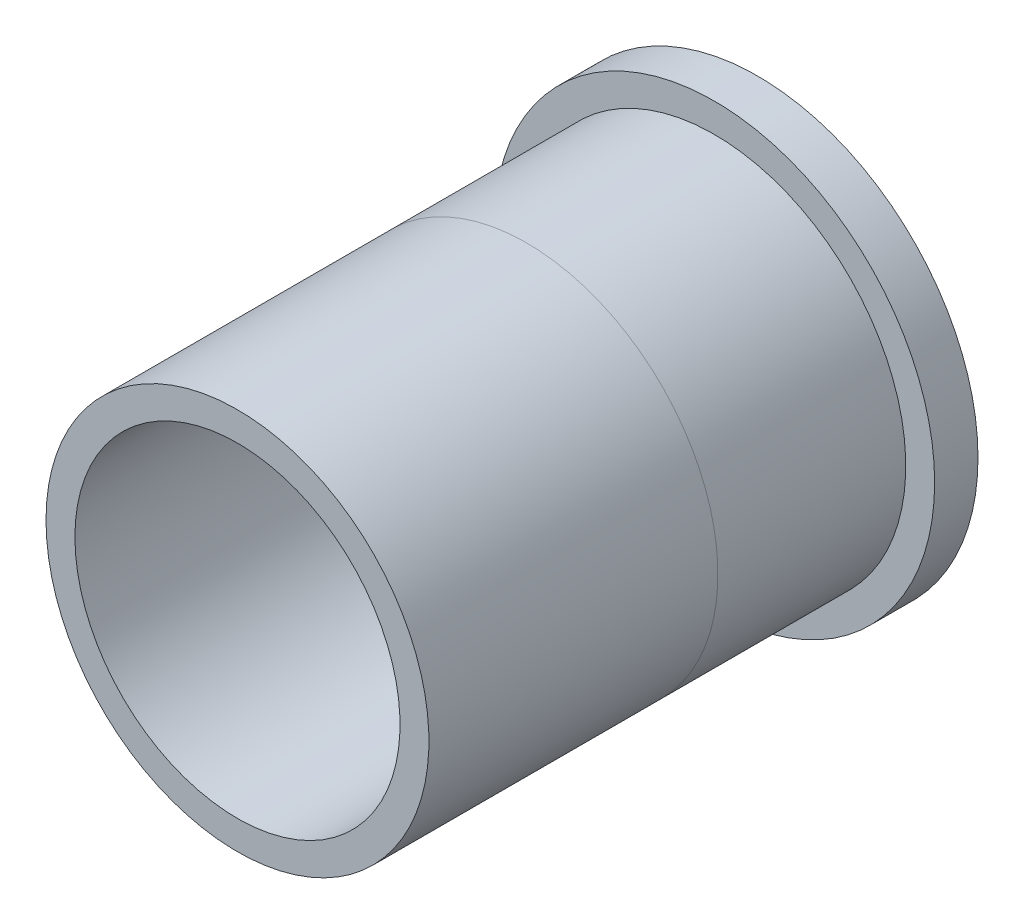
ISO-10303-21;
HEADER;
FILE_DESCRIPTION(('STEP AP214'),'2;1');
FILE_NAME('part.step','',(''),(''),'','','');
FILE_SCHEMA(('AUTOMOTIVE_DESIGN { 1 0 10303 214 1 1 1 1 }'));
ENDSEC;
DATA;
#1=APPLICATION_CONTEXT('core data for automotive mechanical design processes');
#2=APPLICATION_PROTOCOL_DEFINITION('international standard','automotive_design',2000,#1);
#3=PRODUCT_CONTEXT('',#1,'mechanical');
#4=PRODUCT('Part','Part','',(#3));
#5=PRODUCT_RELATED_PRODUCT_CATEGORY('part','',(#4));
#6=PRODUCT_DEFINITION_FORMATION('','',#4);
#7=PRODUCT_DEFINITION_CONTEXT('part definition',#1,'design');
#8=PRODUCT_DEFINITION('design','',#6,#7);
#9=PRODUCT_DEFINITION_SHAPE('','',#8);
#10=(LENGTH_UNIT() NAMED_UNIT(*) SI_UNIT(.MILLI.,.METRE.));
#11=(NAMED_UNIT(*) PLANE_ANGLE_UNIT() SI_UNIT($,.RADIAN.));
#12=(NAMED_UNIT(*) SI_UNIT($,.STERADIAN.) SOLID_ANGLE_UNIT());
#13=UNCERTAINTY_MEASURE_WITH_UNIT(LENGTH_MEASURE(1.E-05),#10,'distance_accuracy_value','');
#14=(GEOMETRIC_REPRESENTATION_CONTEXT(3) GLOBAL_UNCERTAINTY_ASSIGNED_CONTEXT((#13)) GLOBAL_UNIT_ASSIGNED_CONTEXT((#10,
#11,#12)) REPRESENTATION_CONTEXT('',''));
#15=CARTESIAN_POINT('',(0.,0.,0.));
#16=DIRECTION('',(0.,0.,1.));
#17=DIRECTION('',(1.,0.,0.));
#18=AXIS2_PLACEMENT_3D('',#15,#16,#17);
#19=CARTESIAN_POINT('',(0.,0.,-13.4194918334119));
#20=DIRECTION('',(0.,0.,-1.));
#21=DIRECTION('',(-1.,0.,0.));
#22=AXIS2_PLACEMENT_3D('',#19,#20,#21);
#23=PLANE('',#22);
#24=CARTESIAN_POINT('',(0.,0.,-13.4194918334119));
#25=DIRECTION('',(0.,0.,-1.));
#26=DIRECTION('',(-1.,0.,0.));
#27=AXIS2_PLACEMENT_3D('',#24,#25,#26);
#28=CIRCLE('',#27,13.25);
#29=CARTESIAN_POINT('',(-13.25,0.,-13.4194918334119));
#30=VERTEX_POINT('',#29);
#31=EDGE_CURVE('E55',#30,#30,#28,.T.);
#32=ORIENTED_EDGE('',*,*,#31,.T.);
#33=EDGE_LOOP('',(#32));
#34=FACE_BOUND('',#33,.T.);
#35=CARTESIAN_POINT('',(0.,0.,-13.4194918334119));
#36=DIRECTION('',(0.,0.,-1.));
#37=DIRECTION('',(-1.,0.,0.));
#38=AXIS2_PLACEMENT_3D('',#35,#36,#37);
#39=CIRCLE('',#38,11.25);
#40=CARTESIAN_POINT('',(-11.25,0.,-13.4194918334119));
#41=VERTEX_POINT('',#40);
#42=EDGE_CURVE('E46',#41,#41,#39,.F.);
#43=ORIENTED_EDGE('',*,*,#42,.T.);
#44=EDGE_LOOP('',(#43));
#45=FACE_BOUND('',#44,.T.);
#46=ADVANCED_FACE('F42',(#34,#45),#23,.T.);
#47=CARTESIAN_POINT('',(0.,0.,-41.7454545454545));
#48=DIRECTION('',(0.,0.,-1.));
#49=DIRECTION('',(-1.,0.,0.));
#50=AXIS2_PLACEMENT_3D('',#47,#48,#49);
#51=CYLINDRICAL_SURFACE('',#50,13.25);
#52=CARTESIAN_POINT('',(0.,0.,6.58050816658805));
#53=DIRECTION('',(0.,0.,-1.));
#54=DIRECTION('',(-1.,0.,0.));
#55=AXIS2_PLACEMENT_3D('',#52,#53,#54);
#56=CIRCLE('',#55,13.25);
#57=CARTESIAN_POINT('',(-13.25,0.,6.58050816658805));
#58=VERTEX_POINT('',#57);
#59=EDGE_CURVE('E50',#58,#58,#56,.T.);
#60=ORIENTED_EDGE('',*,*,#59,.T.);
#61=EDGE_LOOP('',(#60));
#62=FACE_BOUND('',#61,.T.);
#63=ORIENTED_EDGE('',*,*,#31,.F.);
#64=EDGE_LOOP('',(#63));
#65=FACE_BOUND('',#64,.T.);
#66=ADVANCED_FACE('F44',(#62,#65),#51,.T.);
#67=CARTESIAN_POINT('',(0.,0.,-41.7454545454545));
#68=DIRECTION('',(0.,0.,-1.));
#69=DIRECTION('',(-1.,0.,0.));
#70=AXIS2_PLACEMENT_3D('',#67,#68,#69);
#71=CYLINDRICAL_SURFACE('',#70,11.25);
#72=CARTESIAN_POINT('',(0.,0.,6.58050816658805));
#73=DIRECTION('',(0.,0.,-1.));
#74=DIRECTION('',(-1.,0.,0.));
#75=AXIS2_PLACEMENT_3D('',#72,#73,#74);
#76=CIRCLE('',#75,11.25);
#77=CARTESIAN_POINT('',(-11.25,0.,6.58050816658805));
#78=VERTEX_POINT('',#77);
#79=EDGE_CURVE('E11',#78,#78,#76,.T.);
#80=ORIENTED_EDGE('',*,*,#79,.F.);
#81=EDGE_LOOP('',(#80));
#82=FACE_BOUND('',#81,.T.);
#83=ORIENTED_EDGE('',*,*,#42,.F.);
#84=EDGE_LOOP('',(#83));
#85=FACE_BOUND('',#84,.T.);
#86=ADVANCED_FACE('F64',(#82,#85),#71,.F.);
#87=CARTESIAN_POINT('',(11.25,0.,6.58050816658805));
#88=DIRECTION('',(0.,0.,-1.));
#89=DIRECTION('',(-1.,0.,0.));
#90=AXIS2_PLACEMENT_3D('',#87,#88,#89);
#91=PLANE('',#90);
#92=ORIENTED_EDGE('',*,*,#59,.F.);
#93=EDGE_LOOP('',(#92));
#94=FACE_BOUND('',#93,.T.);
#95=ORIENTED_EDGE('',*,*,#79,.T.);
#96=EDGE_LOOP('',(#95));
#97=FACE_BOUND('',#96,.T.);
#98=ADVANCED_FACE('F66',(#94,#97),#91,.F.);
#99=CLOSED_SHELL('',(#46,#66,#86,#98));
#100=MANIFOLD_SOLID_BREP('B2',#99);
#101=CARTESIAN_POINT('',(0.,0.,-13.4194918334119));
#102=DIRECTION('',(0.,0.,-1.));
#103=DIRECTION('',(-1.,0.,0.));
#104=AXIS2_PLACEMENT_3D('',#101,#102,#103);
#105=PLANE('',#104);
#106=CARTESIAN_POINT('',(0.,0.,-13.4194918334119));
#107=DIRECTION('',(0.,0.,-1.));
#108=DIRECTION('',(-1.,0.,0.));
#109=AXIS2_PLACEMENT_3D('',#106,#107,#108);
#110=CIRCLE('',#109,11.25);
#111=CARTESIAN_POINT('',(-11.25,0.,-13.4194918334119));
#112=VERTEX_POINT('',#111);
#113=EDGE_CURVE('E109',#112,#112,#110,.F.);
#114=ORIENTED_EDGE('',*,*,#113,.F.);
#115=EDGE_LOOP('',(#114));
#116=FACE_BOUND('',#115,.T.);
#117=CARTESIAN_POINT('',(0.,0.,-13.4194918334119));
#118=DIRECTION('',(0.,0.,-1.));
#119=DIRECTION('',(-1.,0.,0.));
#120=AXIS2_PLACEMENT_3D('',#117,#118,#119);
#121=CIRCLE('',#120,13.25);
#122=CARTESIAN_POINT('',(-13.25,0.,-13.4194918334119));
#123=VERTEX_POINT('',#122);
#124=EDGE_CURVE('E41',#123,#123,#121,.T.);
#125=ORIENTED_EDGE('',*,*,#124,.F.);
#126=EDGE_LOOP('',(#125));
#127=FACE_BOUND('',#126,.T.);
#128=ADVANCED_FACE('F103',(#116,#127),#105,.F.);
#129=CARTESIAN_POINT('',(12.25,0.,-26.4435872364588));
#130=DIRECTION('',(0.,0.,1.));
#131=DIRECTION('',(1.,0.,0.));
#132=AXIS2_PLACEMENT_3D('',#129,#130,#131);
#133=PLANE('',#132);
#134=CARTESIAN_POINT('',(0.,0.,-26.4435872364588));
#135=DIRECTION('',(0.,0.,-1.));
#136=DIRECTION('',(-1.,0.,0.));
#137=AXIS2_PLACEMENT_3D('',#134,#135,#136);
#138=CIRCLE('',#137,8.75000000000001);
#139=CARTESIAN_POINT('',(-8.75000000000001,0.,-26.4435872364588));
#140=VERTEX_POINT('',#139);
#141=EDGE_CURVE('E131',#140,#140,#138,.T.);
#142=ORIENTED_EDGE('',*,*,#141,.F.);
#143=EDGE_LOOP('',(#142));
#144=FACE_BOUND('',#143,.T.);
#145=CARTESIAN_POINT('',(0.,0.,-26.4435872364588));
#146=DIRECTION('',(0.,0.,-1.));
#147=DIRECTION('',(-1.,0.,0.));
#148=AXIS2_PLACEMENT_3D('',#145,#146,#147);
#149=CIRCLE('',#148,12.25);
#150=CARTESIAN_POINT('',(-12.25,0.,-26.4435872364588));
#151=VERTEX_POINT('',#150);
#152=EDGE_CURVE('E128',#151,#151,#149,.T.);
#153=ORIENTED_EDGE('',*,*,#152,.T.);
#154=EDGE_LOOP('',(#153));
#155=FACE_BOUND('',#154,.T.);
#156=ADVANCED_FACE('F170',(#144,#155),#133,.F.);
#157=CARTESIAN_POINT('',(0.,0.,-41.7454545454545));
#158=DIRECTION('',(0.,0.,-1.));
#159=DIRECTION('',(-1.,0.,0.));
#160=AXIS2_PLACEMENT_3D('',#157,#158,#159);
#161=CYLINDRICAL_SURFACE('',#160,8.75000000000001);
#162=CARTESIAN_POINT('',(0.,0.,-26.1435872364588));
#163=DIRECTION('',(0.,0.,-1.));
#164=DIRECTION('',(-1.,0.,0.));
#165=AXIS2_PLACEMENT_3D('',#162,#163,#164);
#166=CIRCLE('',#165,8.75000000000001);
#167=CARTESIAN_POINT('',(-8.75000000000001,0.,-26.1435872364588));
#168=VERTEX_POINT('',#167);
#169=EDGE_CURVE('E134',#168,#168,#166,.T.);
#170=ORIENTED_EDGE('',*,*,#169,.F.);
#171=EDGE_LOOP('',(#170));
#172=FACE_BOUND('',#171,.T.);
#173=ORIENTED_EDGE('',*,*,#141,.T.);
#174=EDGE_LOOP('',(#173));
#175=FACE_BOUND('',#174,.T.);
#176=ADVANCED_FACE('F164',(#172,#175),#161,.F.);
#177=CARTESIAN_POINT('',(8.75000000000001,0.,-26.1435872364588));
#178=DIRECTION('',(0.,0.,1.));
#179=DIRECTION('',(1.,0.,0.));
#180=AXIS2_PLACEMENT_3D('',#177,#178,#179);
#181=PLANE('',#180);
#182=CARTESIAN_POINT('',(0.,0.,-26.1435872364588));
#183=DIRECTION('',(0.,0.,-1.));
#184=DIRECTION('',(-1.,0.,0.));
#185=AXIS2_PLACEMENT_3D('',#182,#183,#184);
#186=CIRCLE('',#185,4.);
#187=CARTESIAN_POINT('',(-4.,0.,-26.1435872364588));
#188=VERTEX_POINT('',#187);
#189=EDGE_CURVE('E137',#188,#188,#186,.T.);
#190=ORIENTED_EDGE('',*,*,#189,.F.);
#191=EDGE_LOOP('',(#190));
#192=FACE_BOUND('',#191,.T.);
#193=ORIENTED_EDGE('',*,*,#169,.T.);
#194=EDGE_LOOP('',(#193));
#195=FACE_BOUND('',#194,.T.);
#196=ADVANCED_FACE('F158',(#192,#195),#181,.F.);
#197=CARTESIAN_POINT('',(0.,0.,-41.7454545454545));
#198=DIRECTION('',(0.,0.,-1.));
#199=DIRECTION('',(-1.,0.,0.));
#200=AXIS2_PLACEMENT_3D('',#197,#198,#199);
#201=CYLINDRICAL_SURFACE('',#200,4.);
#202=CARTESIAN_POINT('',(0.,0.,-20.1435872364588));
#203=DIRECTION('',(0.,0.,-1.));
#204=DIRECTION('',(-1.,0.,0.));
#205=AXIS2_PLACEMENT_3D('',#202,#203,#204);
#206=CIRCLE('',#205,4.);
#207=CARTESIAN_POINT('',(-4.,0.,-20.1435872364588));
#208=VERTEX_POINT('',#207);
#209=EDGE_CURVE('E140',#208,#208,#206,.T.);
#210=ORIENTED_EDGE('',*,*,#209,.F.);
#211=EDGE_LOOP('',(#210));
#212=FACE_BOUND('',#211,.T.);
#213=ORIENTED_EDGE('',*,*,#189,.T.);
#214=EDGE_LOOP('',(#213));
#215=FACE_BOUND('',#214,.T.);
#216=ADVANCED_FACE('F152',(#212,#215),#201,.F.);
#217=CARTESIAN_POINT('',(4.,0.,-20.1435872364588));
#218=DIRECTION('',(0.,0.,-1.));
#219=DIRECTION('',(-1.,0.,0.));
#220=AXIS2_PLACEMENT_3D('',#217,#218,#219);
#221=PLANE('',#220);
#222=CARTESIAN_POINT('',(0.,0.,-20.1435872364588));
#223=DIRECTION('',(0.,0.,-1.));
#224=DIRECTION('',(-1.,0.,0.));
#225=AXIS2_PLACEMENT_3D('',#222,#223,#224);
#226=CIRCLE('',#225,11.25);
#227=CARTESIAN_POINT('',(-11.25,0.,-20.1435872364588));
#228=VERTEX_POINT('',#227);
#229=EDGE_CURVE('E143',#228,#228,#226,.T.);
#230=ORIENTED_EDGE('',*,*,#229,.F.);
#231=EDGE_LOOP('',(#230));
#232=FACE_BOUND('',#231,.T.);
#233=ORIENTED_EDGE('',*,*,#209,.T.);
#234=EDGE_LOOP('',(#233));
#235=FACE_BOUND('',#234,.T.);
#236=ADVANCED_FACE('F149',(#232,#235),#221,.F.);
#237=CARTESIAN_POINT('',(0.,0.,-41.7454545454545));
#238=DIRECTION('',(0.,0.,-1.));
#239=DIRECTION('',(-1.,0.,0.));
#240=AXIS2_PLACEMENT_3D('',#237,#238,#239);
#241=CYLINDRICAL_SURFACE('',#240,11.25);
#242=ORIENTED_EDGE('',*,*,#113,.T.);
#243=EDGE_LOOP('',(#242));
#244=FACE_BOUND('',#243,.T.);
#245=ORIENTED_EDGE('',*,*,#229,.T.);
#246=EDGE_LOOP('',(#245));
#247=FACE_BOUND('',#246,.T.);
#248=ADVANCED_FACE('F147',(#244,#247),#241,.F.);
#249=CARTESIAN_POINT('',(0.,0.,-41.7454545454545));
#250=DIRECTION('',(0.,0.,-1.));
#251=DIRECTION('',(-1.,0.,0.));
#252=AXIS2_PLACEMENT_3D('',#249,#250,#251);
#253=CYLINDRICAL_SURFACE('',#252,12.25);
#254=ORIENTED_EDGE('',*,*,#152,.F.);
#255=EDGE_LOOP('',(#254));
#256=FACE_BOUND('',#255,.T.);
#257=CARTESIAN_POINT('',(0.,0.,-29.419491833412));
#258=DIRECTION('',(0.,0.,-1.));
#259=DIRECTION('',(-1.,0.,0.));
#260=AXIS2_PLACEMENT_3D('',#257,#258,#259);
#261=CIRCLE('',#260,12.25);
#262=CARTESIAN_POINT('',(-12.25,0.,-29.419491833412));
#263=VERTEX_POINT('',#262);
#264=EDGE_CURVE('E125',#263,#263,#261,.T.);
#265=ORIENTED_EDGE('',*,*,#264,.T.);
#266=EDGE_LOOP('',(#265));
#267=FACE_BOUND('',#266,.T.);
#268=ADVANCED_FACE('F179',(#256,#267),#253,.F.);
#269=CARTESIAN_POINT('',(15.25,0.,-29.4194918334119));
#270=DIRECTION('',(0.,0.,1.));
#271=DIRECTION('',(1.,0.,0.));
#272=AXIS2_PLACEMENT_3D('',#269,#270,#271);
#273=PLANE('',#272);
#274=ORIENTED_EDGE('',*,*,#264,.F.);
#275=EDGE_LOOP('',(#274));
#276=FACE_BOUND('',#275,.T.);
#277=CARTESIAN_POINT('',(0.,0.,-29.4194918334119));
#278=DIRECTION('',(0.,0.,-1.));
#279=DIRECTION('',(-1.,0.,0.));
#280=AXIS2_PLACEMENT_3D('',#277,#278,#279);
#281=CIRCLE('',#280,15.25);
#282=CARTESIAN_POINT('',(-15.25,0.,-29.4194918334119));
#283=VERTEX_POINT('',#282);
#284=EDGE_CURVE('E122',#283,#283,#281,.T.);
#285=ORIENTED_EDGE('',*,*,#284,.T.);
#286=EDGE_LOOP('',(#285));
#287=FACE_BOUND('',#286,.T.);
#288=ADVANCED_FACE('F182',(#276,#287),#273,.F.);
#289=CARTESIAN_POINT('',(0.,0.,-41.7454545454545));
#290=DIRECTION('',(0.,0.,-1.));
#291=DIRECTION('',(-1.,0.,0.));
#292=AXIS2_PLACEMENT_3D('',#289,#290,#291);
#293=CYLINDRICAL_SURFACE('',#292,15.25);
#294=ORIENTED_EDGE('',*,*,#284,.F.);
#295=EDGE_LOOP('',(#294));
#296=FACE_BOUND('',#295,.T.);
#297=CARTESIAN_POINT('',(0.,0.,-26.4194918334119));
#298=DIRECTION('',(0.,0.,-1.));
#299=DIRECTION('',(-1.,0.,0.));
#300=AXIS2_PLACEMENT_3D('',#297,#298,#299);
#301=CIRCLE('',#300,15.25);
#302=CARTESIAN_POINT('',(-15.25,0.,-26.4194918334119));
#303=VERTEX_POINT('',#302);
#304=EDGE_CURVE('E117',#303,#303,#301,.T.);
#305=ORIENTED_EDGE('',*,*,#304,.T.);
#306=EDGE_LOOP('',(#305));
#307=FACE_BOUND('',#306,.T.);
#308=ADVANCED_FACE('F188',(#296,#307),#293,.T.);
#309=CARTESIAN_POINT('',(13.25,0.,-26.4194918334119));
#310=DIRECTION('',(0.,0.,-1.));
#311=DIRECTION('',(-1.,0.,0.));
#312=AXIS2_PLACEMENT_3D('',#309,#310,#311);
#313=PLANE('',#312);
#314=ORIENTED_EDGE('',*,*,#304,.F.);
#315=EDGE_LOOP('',(#314));
#316=FACE_BOUND('',#315,.T.);
#317=CARTESIAN_POINT('',(0.,0.,-26.4194918334119));
#318=DIRECTION('',(0.,0.,-1.));
#319=DIRECTION('',(-1.,0.,0.));
#320=AXIS2_PLACEMENT_3D('',#317,#318,#319);
#321=CIRCLE('',#320,13.25);
#322=CARTESIAN_POINT('',(-13.25,0.,-26.4194918334119));
#323=VERTEX_POINT('',#322);
#324=EDGE_CURVE('E113',#323,#323,#321,.T.);
#325=ORIENTED_EDGE('',*,*,#324,.T.);
#326=EDGE_LOOP('',(#325));
#327=FACE_BOUND('',#326,.T.);
#328=ADVANCED_FACE('F194',(#316,#327),#313,.F.);
#329=CARTESIAN_POINT('',(0.,0.,-41.7454545454545));
#330=DIRECTION('',(0.,0.,-1.));
#331=DIRECTION('',(-1.,0.,0.));
#332=AXIS2_PLACEMENT_3D('',#329,#330,#331);
#333=CYLINDRICAL_SURFACE('',#332,13.25);
#334=ORIENTED_EDGE('',*,*,#124,.T.);
#335=EDGE_LOOP('',(#334));
#336=FACE_BOUND('',#335,.T.);
#337=ORIENTED_EDGE('',*,*,#324,.F.);
#338=EDGE_LOOP('',(#337));
#339=FACE_BOUND('',#338,.T.);
#340=ADVANCED_FACE('F200',(#336,#339),#333,.T.);
#341=CLOSED_SHELL('',(#128,#156,#176,#196,#216,#236,#248,#268,#288,#308,#328,#340));
#342=MANIFOLD_SOLID_BREP('B6',#341);
#343=ADVANCED_BREP_SHAPE_REPRESENTATION('',(#18,#100,#342),#14);
#344=SHAPE_DEFINITION_REPRESENTATION(#9,#343);
ENDSEC;
END-ISO-10303-21;
